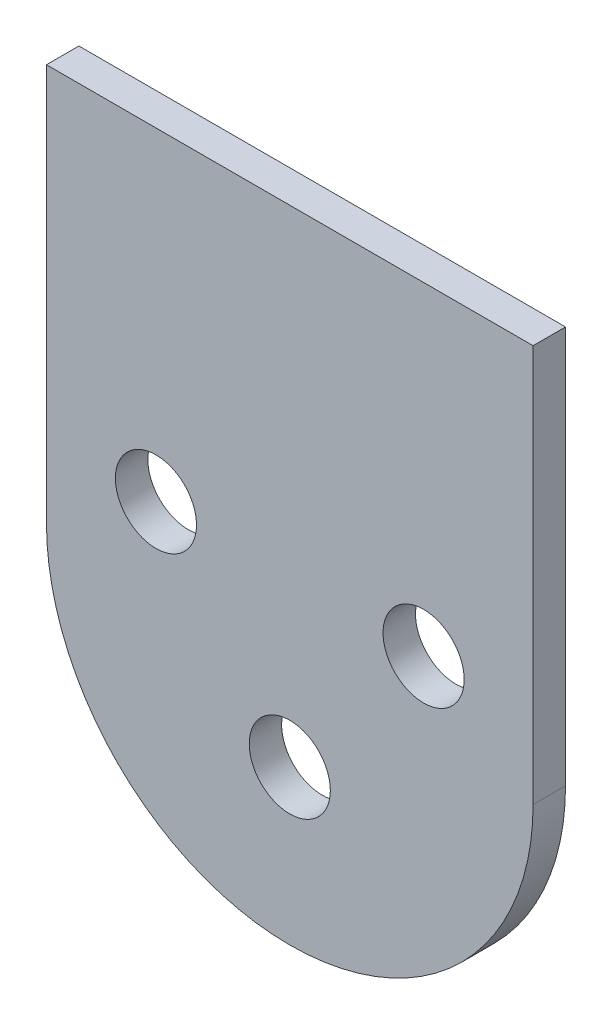
ISO-10303-21;
HEADER;
FILE_DESCRIPTION(('STEP AP214'),'2;1');
FILE_NAME('part.step','',(''),(''),'','','');
FILE_SCHEMA(('AUTOMOTIVE_DESIGN { 1 0 10303 214 1 1 1 1 }'));
ENDSEC;
DATA;
#1=APPLICATION_CONTEXT('core data for automotive mechanical design processes');
#2=APPLICATION_PROTOCOL_DEFINITION('international standard','automotive_design',2000,#1);
#3=PRODUCT_CONTEXT('',#1,'mechanical');
#4=PRODUCT('Part','Part','',(#3));
#5=PRODUCT_RELATED_PRODUCT_CATEGORY('part','',(#4));
#6=PRODUCT_DEFINITION_FORMATION('','',#4);
#7=PRODUCT_DEFINITION_CONTEXT('part definition',#1,'design');
#8=PRODUCT_DEFINITION('design','',#6,#7);
#9=PRODUCT_DEFINITION_SHAPE('','',#8);
#10=(LENGTH_UNIT() NAMED_UNIT(*) SI_UNIT(.MILLI.,.METRE.));
#11=(NAMED_UNIT(*) PLANE_ANGLE_UNIT() SI_UNIT($,.RADIAN.));
#12=(NAMED_UNIT(*) SI_UNIT($,.STERADIAN.) SOLID_ANGLE_UNIT());
#13=UNCERTAINTY_MEASURE_WITH_UNIT(LENGTH_MEASURE(1.E-05),#10,'distance_accuracy_value','');
#14=(GEOMETRIC_REPRESENTATION_CONTEXT(3) GLOBAL_UNCERTAINTY_ASSIGNED_CONTEXT((#13)) GLOBAL_UNIT_ASSIGNED_CONTEXT((#10,
#11,#12)) REPRESENTATION_CONTEXT('',''));
#15=CARTESIAN_POINT('',(0.,0.,0.));
#16=DIRECTION('',(0.,0.,1.));
#17=DIRECTION('',(1.,0.,0.));
#18=AXIS2_PLACEMENT_3D('',#15,#16,#17);
#19=CARTESIAN_POINT('',(0.,-24.5,2.));
#20=DIRECTION('',(0.,0.,1.));
#21=DIRECTION('',(1.,0.,0.));
#22=AXIS2_PLACEMENT_3D('',#19,#20,#21);
#23=PLANE('',#22);
#24=CARTESIAN_POINT('',(0.,-30.,2.));
#25=DIRECTION('',(0.,0.,1.));
#26=DIRECTION('',(1.,0.,0.));
#27=AXIS2_PLACEMENT_3D('',#24,#25,#26);
#28=CIRCLE('',#27,2.5);
#29=CARTESIAN_POINT('',(2.50000000000001,-30.,2.));
#30=VERTEX_POINT('',#29);
#31=EDGE_CURVE('E122',#30,#30,#28,.T.);
#32=ORIENTED_EDGE('',*,*,#31,.F.);
#33=EDGE_LOOP('',(#32));
#34=FACE_BOUND('',#33,.T.);
#35=DIRECTION('',(0.,-1.,0.));
#36=VECTOR('',#35,1.);
#37=CARTESIAN_POINT('',(-15.,0.,2.));
#38=LINE('',#37,#36);
#39=CARTESIAN_POINT('',(-15.,0.,2.));
#40=VERTEX_POINT('',#39);
#41=CARTESIAN_POINT('',(-15.,-24.5,2.));
#42=VERTEX_POINT('',#41);
#43=EDGE_CURVE('E91',#40,#42,#38,.T.);
#44=ORIENTED_EDGE('',*,*,#43,.T.);
#45=CARTESIAN_POINT('',(0.,-24.5,2.));
#46=DIRECTION('',(0.,0.,1.));
#47=DIRECTION('',(1.,0.,0.));
#48=AXIS2_PLACEMENT_3D('',#45,#46,#47);
#49=CIRCLE('',#48,15.);
#50=CARTESIAN_POINT('',(15.,-24.5,2.));
#51=VERTEX_POINT('',#50);
#52=EDGE_CURVE('E86',#42,#51,#49,.T.);
#53=ORIENTED_EDGE('',*,*,#52,.T.);
#54=DIRECTION('',(0.,1.,0.));
#55=VECTOR('',#54,1.);
#56=CARTESIAN_POINT('',(15.,0.,2.));
#57=LINE('',#56,#55);
#58=CARTESIAN_POINT('',(15.,0.,2.));
#59=VERTEX_POINT('',#58);
#60=EDGE_CURVE('E93',#51,#59,#57,.T.);
#61=ORIENTED_EDGE('',*,*,#60,.T.);
#62=DIRECTION('',(-1.,0.,0.));
#63=VECTOR('',#62,1.);
#64=CARTESIAN_POINT('',(15.,0.,2.));
#65=LINE('',#64,#63);
#66=EDGE_CURVE('E59',#59,#40,#65,.T.);
#67=ORIENTED_EDGE('',*,*,#66,.T.);
#68=EDGE_LOOP('',(#44,#53,#61,#67));
#69=FACE_BOUND('',#68,.T.);
#70=CARTESIAN_POINT('',(8.25,-19.9532343512949,2.));
#71=DIRECTION('',(0.,0.,1.));
#72=DIRECTION('',(1.,0.,0.));
#73=AXIS2_PLACEMENT_3D('',#70,#71,#72);
#74=CIRCLE('',#73,2.5);
#75=CARTESIAN_POINT('',(10.75,-19.9532343512949,2.));
#76=VERTEX_POINT('',#75);
#77=EDGE_CURVE('E107',#76,#76,#74,.T.);
#78=ORIENTED_EDGE('',*,*,#77,.F.);
#79=EDGE_LOOP('',(#78));
#80=FACE_BOUND('',#79,.T.);
#81=CARTESIAN_POINT('',(-8.25,-19.9532343512949,2.));
#82=DIRECTION('',(0.,0.,1.));
#83=DIRECTION('',(-1.,0.,0.));
#84=AXIS2_PLACEMENT_3D('',#81,#82,#83);
#85=CIRCLE('',#84,2.5);
#86=CARTESIAN_POINT('',(-10.75,-19.9532343512949,2.));
#87=VERTEX_POINT('',#86);
#88=EDGE_CURVE('E129',#87,#87,#85,.T.);
#89=ORIENTED_EDGE('',*,*,#88,.F.);
#90=EDGE_LOOP('',(#89));
#91=FACE_BOUND('',#90,.T.);
#92=ADVANCED_FACE('F41',(#34,#69,#80,#91),#23,.T.);
#93=CARTESIAN_POINT('',(0.,-24.5,0.));
#94=DIRECTION('',(0.,0.,1.));
#95=DIRECTION('',(1.,0.,0.));
#96=AXIS2_PLACEMENT_3D('',#93,#94,#95);
#97=PLANE('',#96);
#98=DIRECTION('',(0.,-1.,0.));
#99=VECTOR('',#98,1.);
#100=CARTESIAN_POINT('',(-15.,0.,0.));
#101=LINE('',#100,#99);
#102=CARTESIAN_POINT('',(-15.,0.,0.));
#103=VERTEX_POINT('',#102);
#104=CARTESIAN_POINT('',(-15.,-24.5,0.));
#105=VERTEX_POINT('',#104);
#106=EDGE_CURVE('E104',#103,#105,#101,.T.);
#107=ORIENTED_EDGE('',*,*,#106,.F.);
#108=DIRECTION('',(-1.,0.,0.));
#109=VECTOR('',#108,1.);
#110=CARTESIAN_POINT('',(15.,0.,0.));
#111=LINE('',#110,#109);
#112=CARTESIAN_POINT('',(15.,0.,0.));
#113=VERTEX_POINT('',#112);
#114=EDGE_CURVE('E83',#113,#103,#111,.T.);
#115=ORIENTED_EDGE('',*,*,#114,.F.);
#116=DIRECTION('',(0.,1.,0.));
#117=VECTOR('',#116,1.);
#118=CARTESIAN_POINT('',(15.,0.,0.));
#119=LINE('',#118,#117);
#120=CARTESIAN_POINT('',(15.,-24.5,0.));
#121=VERTEX_POINT('',#120);
#122=EDGE_CURVE('E73',#121,#113,#119,.T.);
#123=ORIENTED_EDGE('',*,*,#122,.F.);
#124=CARTESIAN_POINT('',(0.,-24.5,0.));
#125=DIRECTION('',(0.,0.,1.));
#126=DIRECTION('',(1.,0.,0.));
#127=AXIS2_PLACEMENT_3D('',#124,#125,#126);
#128=CIRCLE('',#127,15.);
#129=EDGE_CURVE('E100',#105,#121,#128,.T.);
#130=ORIENTED_EDGE('',*,*,#129,.F.);
#131=EDGE_LOOP('',(#107,#115,#123,#130));
#132=FACE_BOUND('',#131,.T.);
#133=CARTESIAN_POINT('',(8.25,-19.9532343512949,0.));
#134=DIRECTION('',(0.,0.,1.));
#135=DIRECTION('',(1.,0.,0.));
#136=AXIS2_PLACEMENT_3D('',#133,#134,#135);
#137=CIRCLE('',#136,2.5);
#138=CARTESIAN_POINT('',(10.75,-19.9532343512949,0.));
#139=VERTEX_POINT('',#138);
#140=EDGE_CURVE('E118',#139,#139,#137,.T.);
#141=ORIENTED_EDGE('',*,*,#140,.T.);
#142=EDGE_LOOP('',(#141));
#143=FACE_BOUND('',#142,.T.);
#144=CARTESIAN_POINT('',(0.,-30.,0.));
#145=DIRECTION('',(0.,0.,1.));
#146=DIRECTION('',(1.,0.,0.));
#147=AXIS2_PLACEMENT_3D('',#144,#145,#146);
#148=CIRCLE('',#147,2.5);
#149=CARTESIAN_POINT('',(2.50000000000001,-30.,0.));
#150=VERTEX_POINT('',#149);
#151=EDGE_CURVE('E127',#150,#150,#148,.T.);
#152=ORIENTED_EDGE('',*,*,#151,.T.);
#153=EDGE_LOOP('',(#152));
#154=FACE_BOUND('',#153,.T.);
#155=CARTESIAN_POINT('',(-8.25,-19.9532343512949,0.));
#156=DIRECTION('',(0.,0.,1.));
#157=DIRECTION('',(-1.,0.,0.));
#158=AXIS2_PLACEMENT_3D('',#155,#156,#157);
#159=CIRCLE('',#158,2.5);
#160=CARTESIAN_POINT('',(-10.75,-19.9532343512949,0.));
#161=VERTEX_POINT('',#160);
#162=EDGE_CURVE('E134',#161,#161,#159,.T.);
#163=ORIENTED_EDGE('',*,*,#162,.T.);
#164=EDGE_LOOP('',(#163));
#165=FACE_BOUND('',#164,.T.);
#166=ADVANCED_FACE('F117',(#132,#143,#154,#165),#97,.F.);
#167=CARTESIAN_POINT('',(-15.,0.,2.));
#168=DIRECTION('',(1.,0.,0.));
#169=DIRECTION('',(0.,1.,0.));
#170=AXIS2_PLACEMENT_3D('',#167,#168,#169);
#171=PLANE('',#170);
#172=ORIENTED_EDGE('',*,*,#106,.T.);
#173=DIRECTION('',(0.,0.,-1.));
#174=VECTOR('',#173,1.);
#175=CARTESIAN_POINT('',(-15.,-24.5,2.));
#176=LINE('',#175,#174);
#177=EDGE_CURVE('E11',#42,#105,#176,.T.);
#178=ORIENTED_EDGE('',*,*,#177,.F.);
#179=ORIENTED_EDGE('',*,*,#43,.F.);
#180=DIRECTION('',(0.,0.,-1.));
#181=VECTOR('',#180,1.);
#182=CARTESIAN_POINT('',(-15.,0.,2.));
#183=LINE('',#182,#181);
#184=EDGE_CURVE('E101',#40,#103,#183,.T.);
#185=ORIENTED_EDGE('',*,*,#184,.T.);
#186=EDGE_LOOP('',(#172,#178,#179,#185));
#187=FACE_BOUND('',#186,.T.);
#188=ADVANCED_FACE('F43',(#187),#171,.F.);
#189=CARTESIAN_POINT('',(0.,-24.5,2.));
#190=DIRECTION('',(0.,0.,-1.));
#191=DIRECTION('',(-1.,0.,0.));
#192=AXIS2_PLACEMENT_3D('',#189,#190,#191);
#193=CYLINDRICAL_SURFACE('',#192,15.);
#194=ORIENTED_EDGE('',*,*,#129,.T.);
#195=DIRECTION('',(0.,0.,-1.));
#196=VECTOR('',#195,1.);
#197=CARTESIAN_POINT('',(15.,-24.5,2.));
#198=LINE('',#197,#196);
#199=EDGE_CURVE('E49',#51,#121,#198,.T.);
#200=ORIENTED_EDGE('',*,*,#199,.F.);
#201=ORIENTED_EDGE('',*,*,#52,.F.);
#202=ORIENTED_EDGE('',*,*,#177,.T.);
#203=EDGE_LOOP('',(#194,#200,#201,#202));
#204=FACE_BOUND('',#203,.T.);
#205=ADVANCED_FACE('F96',(#204),#193,.T.);
#206=CARTESIAN_POINT('',(15.,0.,2.));
#207=DIRECTION('',(-1.,0.,0.));
#208=DIRECTION('',(0.,-1.,0.));
#209=AXIS2_PLACEMENT_3D('',#206,#207,#208);
#210=PLANE('',#209);
#211=ORIENTED_EDGE('',*,*,#122,.T.);
#212=DIRECTION('',(0.,0.,-1.));
#213=VECTOR('',#212,1.);
#214=CARTESIAN_POINT('',(15.,0.,2.));
#215=LINE('',#214,#213);
#216=EDGE_CURVE('E98',#59,#113,#215,.T.);
#217=ORIENTED_EDGE('',*,*,#216,.F.);
#218=ORIENTED_EDGE('',*,*,#60,.F.);
#219=ORIENTED_EDGE('',*,*,#199,.T.);
#220=EDGE_LOOP('',(#211,#217,#218,#219));
#221=FACE_BOUND('',#220,.T.);
#222=ADVANCED_FACE('F97',(#221),#210,.F.);
#223=CARTESIAN_POINT('',(15.,0.,2.));
#224=DIRECTION('',(0.,-1.,0.));
#225=DIRECTION('',(0.,0.,-1.));
#226=AXIS2_PLACEMENT_3D('',#223,#224,#225);
#227=PLANE('',#226);
#228=ORIENTED_EDGE('',*,*,#114,.T.);
#229=ORIENTED_EDGE('',*,*,#184,.F.);
#230=ORIENTED_EDGE('',*,*,#66,.F.);
#231=ORIENTED_EDGE('',*,*,#216,.T.);
#232=EDGE_LOOP('',(#228,#229,#230,#231));
#233=FACE_BOUND('',#232,.T.);
#234=ADVANCED_FACE('F114',(#233),#227,.F.);
#235=CARTESIAN_POINT('',(8.25,-19.9532343512949,2.));
#236=DIRECTION('',(0.,0.,-1.));
#237=DIRECTION('',(-1.,0.,0.));
#238=AXIS2_PLACEMENT_3D('',#235,#236,#237);
#239=CYLINDRICAL_SURFACE('',#238,2.5);
#240=ORIENTED_EDGE('',*,*,#77,.T.);
#241=EDGE_LOOP('',(#240));
#242=FACE_BOUND('',#241,.T.);
#243=ORIENTED_EDGE('',*,*,#140,.F.);
#244=EDGE_LOOP('',(#243));
#245=FACE_BOUND('',#244,.T.);
#246=ADVANCED_FACE('F147',(#242,#245),#239,.F.);
#247=CARTESIAN_POINT('',(0.,-30.,2.));
#248=DIRECTION('',(0.,0.,-1.));
#249=DIRECTION('',(-1.,0.,0.));
#250=AXIS2_PLACEMENT_3D('',#247,#248,#249);
#251=CYLINDRICAL_SURFACE('',#250,2.5);
#252=ORIENTED_EDGE('',*,*,#31,.T.);
#253=EDGE_LOOP('',(#252));
#254=FACE_BOUND('',#253,.T.);
#255=ORIENTED_EDGE('',*,*,#151,.F.);
#256=EDGE_LOOP('',(#255));
#257=FACE_BOUND('',#256,.T.);
#258=ADVANCED_FACE('F191',(#254,#257),#251,.F.);
#259=CARTESIAN_POINT('',(-8.25,-19.9532343512949,2.));
#260=DIRECTION('',(0.,0.,-1.));
#261=DIRECTION('',(-1.,0.,0.));
#262=AXIS2_PLACEMENT_3D('',#259,#260,#261);
#263=CYLINDRICAL_SURFACE('',#262,2.5);
#264=ORIENTED_EDGE('',*,*,#88,.T.);
#265=EDGE_LOOP('',(#264));
#266=FACE_BOUND('',#265,.T.);
#267=ORIENTED_EDGE('',*,*,#162,.F.);
#268=EDGE_LOOP('',(#267));
#269=FACE_BOUND('',#268,.T.);
#270=ADVANCED_FACE('F137',(#266,#269),#263,.F.);
#271=CLOSED_SHELL('',(#92,#166,#188,#205,#222,#234,#246,#258,#270));
#272=MANIFOLD_SOLID_BREP('B2',#271);
#273=ADVANCED_BREP_SHAPE_REPRESENTATION('',(#18,#272),#14);
#274=SHAPE_DEFINITION_REPRESENTATION(#9,#273);
ENDSEC;
END-ISO-10303-21;
